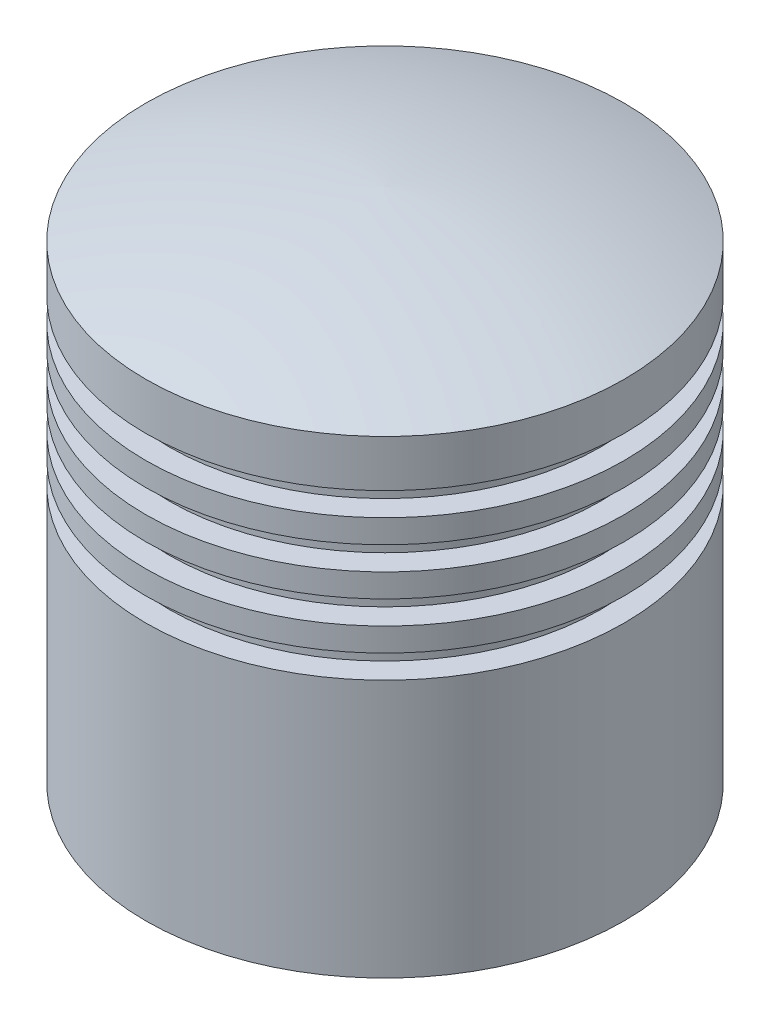
ISO-10303-21;
HEADER;
FILE_DESCRIPTION(('STEP AP214'),'2;1');
FILE_NAME('part.step','',(''),(''),'','','');
FILE_SCHEMA(('AUTOMOTIVE_DESIGN { 1 0 10303 214 1 1 1 1 }'));
ENDSEC;
DATA;
#1=APPLICATION_CONTEXT('core data for automotive mechanical design processes');
#2=APPLICATION_PROTOCOL_DEFINITION('international standard','automotive_design',2000,#1);
#3=PRODUCT_CONTEXT('',#1,'mechanical');
#4=PRODUCT('Part','Part','',(#3));
#5=PRODUCT_RELATED_PRODUCT_CATEGORY('part','',(#4));
#6=PRODUCT_DEFINITION_FORMATION('','',#4);
#7=PRODUCT_DEFINITION_CONTEXT('part definition',#1,'design');
#8=PRODUCT_DEFINITION('design','',#6,#7);
#9=PRODUCT_DEFINITION_SHAPE('','',#8);
#10=(LENGTH_UNIT() NAMED_UNIT(*) SI_UNIT(.MILLI.,.METRE.));
#11=(NAMED_UNIT(*) PLANE_ANGLE_UNIT() SI_UNIT($,.RADIAN.));
#12=(NAMED_UNIT(*) SI_UNIT($,.STERADIAN.) SOLID_ANGLE_UNIT());
#13=UNCERTAINTY_MEASURE_WITH_UNIT(LENGTH_MEASURE(1.E-05),#10,'distance_accuracy_value','');
#14=(GEOMETRIC_REPRESENTATION_CONTEXT(3) GLOBAL_UNCERTAINTY_ASSIGNED_CONTEXT((#13)) GLOBAL_UNIT_ASSIGNED_CONTEXT((#10,
#11,#12)) REPRESENTATION_CONTEXT('',''));
#15=CARTESIAN_POINT('',(0.,0.,0.));
#16=DIRECTION('',(0.,0.,1.));
#17=DIRECTION('',(1.,0.,0.));
#18=AXIS2_PLACEMENT_3D('',#15,#16,#17);
#19=CARTESIAN_POINT('',(46.,90.,0.));
#20=DIRECTION('',(0.,-1.,0.));
#21=DIRECTION('',(0.,0.,-1.));
#22=AXIS2_PLACEMENT_3D('',#19,#20,#21);
#23=PLANE('',#22);
#24=CARTESIAN_POINT('',(0.,90.,0.));
#25=DIRECTION('',(0.,-1.,0.));
#26=DIRECTION('',(0.,0.,-1.));
#27=AXIS2_PLACEMENT_3D('',#24,#25,#26);
#28=CIRCLE('',#27,51.);
#29=CARTESIAN_POINT('',(0.,90.,-51.));
#30=VERTEX_POINT('',#29);
#31=EDGE_CURVE('E11',#30,#30,#28,.T.);
#32=ORIENTED_EDGE('',*,*,#31,.T.);
#33=EDGE_LOOP('',(#32));
#34=FACE_BOUND('',#33,.T.);
#35=CARTESIAN_POINT('',(0.,90.,0.));
#36=DIRECTION('',(0.,-1.,0.));
#37=DIRECTION('',(0.,0.,-1.));
#38=AXIS2_PLACEMENT_3D('',#35,#36,#37);
#39=CIRCLE('',#38,46.);
#40=CARTESIAN_POINT('',(0.,90.,-46.));
#41=VERTEX_POINT('',#40);
#42=EDGE_CURVE('E144',#41,#41,#39,.T.);
#43=ORIENTED_EDGE('',*,*,#42,.F.);
#44=EDGE_LOOP('',(#43));
#45=FACE_BOUND('',#44,.T.);
#46=ADVANCED_FACE('F43',(#34,#45),#23,.T.);
#47=CARTESIAN_POINT('',(0.,0.,0.));
#48=DIRECTION('',(0.,-1.,0.));
#49=DIRECTION('',(0.,0.,-1.));
#50=AXIS2_PLACEMENT_3D('',#47,#48,#49);
#51=CYLINDRICAL_SURFACE('',#50,51.);
#52=CARTESIAN_POINT('',(0.,100.,0.));
#53=DIRECTION('',(0.,-1.,0.));
#54=DIRECTION('',(0.,0.,-1.));
#55=AXIS2_PLACEMENT_3D('',#52,#53,#54);
#56=CIRCLE('',#55,51.);
#57=CARTESIAN_POINT('',(0.,100.,-51.));
#58=VERTEX_POINT('',#57);
#59=EDGE_CURVE('E51',#58,#58,#56,.T.);
#60=ORIENTED_EDGE('',*,*,#59,.T.);
#61=EDGE_LOOP('',(#60));
#62=FACE_BOUND('',#61,.T.);
#63=ORIENTED_EDGE('',*,*,#31,.F.);
#64=EDGE_LOOP('',(#63));
#65=FACE_BOUND('',#64,.T.);
#66=ADVANCED_FACE('F61',(#62,#65),#51,.T.);
#67=CARTESIAN_POINT('',(0.,-59.8629003636879,6.82605889484076));
#68=DIRECTION('',(-1.,0.,0.));
#69=DIRECTION('',(0.,0.,-1.));
#70=AXIS2_PLACEMENT_3D('',#67,#68,#69);
#71=CIRCLE('',#70,170.);
#72=TRIMMED_CURVE('',#71,(PARAMETER_VALUE(-1.53063224157507)),
(PARAMETER_VALUE(1.53063224157507)),.T.,.PARAMETER.);
#73=CARTESIAN_POINT('',(0.,-59.8629003636879,0.));
#74=DIRECTION('',(0.,-1.,0.));
#75=AXIS1_PLACEMENT('',#73,#74);
#76=SURFACE_OF_REVOLUTION('',#72,#75);
#77=CARTESIAN_POINT('',(0.,110.,0.));
#78=VERTEX_POINT('',#77);
#79=VERTEX_LOOP('',#78);
#80=FACE_BOUND('',#79,.T.);
#81=ORIENTED_EDGE('',*,*,#59,.F.);
#82=EDGE_LOOP('',(#81));
#83=FACE_BOUND('',#82,.T.);
#84=ADVANCED_FACE('F57',(#80,#83),#76,.T.);
#85=CARTESIAN_POINT('',(0.,-59.8629003636879,6.82605889484076));
#86=DIRECTION('',(-1.,0.,0.));
#87=DIRECTION('',(0.,0.,-1.));
#88=AXIS2_PLACEMENT_3D('',#85,#86,#87);
#89=CIRCLE('',#88,163.);
#90=TRIMMED_CURVE('',#89,(PARAMETER_VALUE(-1.52890641478153)),
(PARAMETER_VALUE(1.52890641478153)),.T.,.PARAMETER.);
#91=CARTESIAN_POINT('',(0.,-59.8629003636879,0.));
#92=DIRECTION('',(0.,-1.,0.));
#93=AXIS1_PLACEMENT('',#91,#92);
#94=SURFACE_OF_REVOLUTION('',#90,#93);
#95=CARTESIAN_POINT('',(0.,97.4105197667831,0.));
#96=DIRECTION('',(0.,-1.,0.));
#97=DIRECTION('',(0.,0.,-1.));
#98=AXIS2_PLACEMENT_3D('',#95,#96,#97);
#99=CIRCLE('',#98,36.);
#100=CARTESIAN_POINT('',(0.,97.4105197667831,-36.));
#101=VERTEX_POINT('',#100);
#102=EDGE_CURVE('E67',#101,#101,#99,.T.);
#103=ORIENTED_EDGE('',*,*,#102,.T.);
#104=EDGE_LOOP('',(#103));
#105=FACE_BOUND('',#104,.T.);
#106=CARTESIAN_POINT('',(0.,102.994107222612,0.));
#107=VERTEX_POINT('',#106);
#108=VERTEX_LOOP('',#107);
#109=FACE_BOUND('',#108,.T.);
#110=ADVANCED_FACE('F60',(#105,#109),#94,.F.);
#111=CARTESIAN_POINT('',(0.,0.,0.));
#112=DIRECTION('',(0.,-1.,0.));
#113=DIRECTION('',(0.,0.,-1.));
#114=AXIS2_PLACEMENT_3D('',#111,#112,#113);
#115=CYLINDRICAL_SURFACE('',#114,36.);
#116=CARTESIAN_POINT('',(0.,30.,0.));
#117=DIRECTION('',(0.,-1.,0.));
#118=DIRECTION('',(0.,0.,-1.));
#119=AXIS2_PLACEMENT_3D('',#116,#117,#118);
#120=CIRCLE('',#119,36.);
#121=CARTESIAN_POINT('',(0.,30.,-36.));
#122=VERTEX_POINT('',#121);
#123=EDGE_CURVE('E70',#122,#122,#120,.T.);
#124=ORIENTED_EDGE('',*,*,#123,.T.);
#125=EDGE_LOOP('',(#124));
#126=FACE_BOUND('',#125,.T.);
#127=ORIENTED_EDGE('',*,*,#102,.F.);
#128=EDGE_LOOP('',(#127));
#129=FACE_BOUND('',#128,.T.);
#130=ADVANCED_FACE('F164',(#126,#129),#115,.F.);
#131=CARTESIAN_POINT('',(43.,30.,0.));
#132=DIRECTION('',(0.,-1.,0.));
#133=DIRECTION('',(0.,0.,-1.));
#134=AXIS2_PLACEMENT_3D('',#131,#132,#133);
#135=PLANE('',#134);
#136=CARTESIAN_POINT('',(0.,30.,0.));
#137=DIRECTION('',(0.,-1.,0.));
#138=DIRECTION('',(0.,0.,-1.));
#139=AXIS2_PLACEMENT_3D('',#136,#137,#138);
#140=CIRCLE('',#139,43.);
#141=CARTESIAN_POINT('',(0.,30.,-43.));
#142=VERTEX_POINT('',#141);
#143=EDGE_CURVE('E76',#142,#142,#140,.T.);
#144=ORIENTED_EDGE('',*,*,#143,.T.);
#145=EDGE_LOOP('',(#144));
#146=FACE_BOUND('',#145,.T.);
#147=ORIENTED_EDGE('',*,*,#123,.F.);
#148=EDGE_LOOP('',(#147));
#149=FACE_BOUND('',#148,.T.);
#150=ADVANCED_FACE('F168',(#146,#149),#135,.T.);
#151=CARTESIAN_POINT('',(0.,0.,0.));
#152=DIRECTION('',(0.,-1.,0.));
#153=DIRECTION('',(0.,0.,-1.));
#154=AXIS2_PLACEMENT_3D('',#151,#152,#153);
#155=CYLINDRICAL_SURFACE('',#154,43.);
#156=CARTESIAN_POINT('',(0.,0.,0.));
#157=DIRECTION('',(0.,-1.,0.));
#158=DIRECTION('',(0.,0.,-1.));
#159=AXIS2_PLACEMENT_3D('',#156,#157,#158);
#160=CIRCLE('',#159,43.);
#161=CARTESIAN_POINT('',(0.,0.,-43.));
#162=VERTEX_POINT('',#161);
#163=EDGE_CURVE('E80',#162,#162,#160,.T.);
#164=ORIENTED_EDGE('',*,*,#163,.T.);
#165=EDGE_LOOP('',(#164));
#166=FACE_BOUND('',#165,.T.);
#167=ORIENTED_EDGE('',*,*,#143,.F.);
#168=EDGE_LOOP('',(#167));
#169=FACE_BOUND('',#168,.T.);
#170=ADVANCED_FACE('F172',(#166,#169),#155,.F.);
#171=CARTESIAN_POINT('',(43.,0.,0.));
#172=DIRECTION('',(0.,-1.,0.));
#173=DIRECTION('',(0.,0.,-1.));
#174=AXIS2_PLACEMENT_3D('',#171,#172,#173);
#175=PLANE('',#174);
#176=CARTESIAN_POINT('',(0.,0.,0.));
#177=DIRECTION('',(0.,-1.,0.));
#178=DIRECTION('',(0.,0.,-1.));
#179=AXIS2_PLACEMENT_3D('',#176,#177,#178);
#180=CIRCLE('',#179,51.);
#181=CARTESIAN_POINT('',(0.,0.,-51.));
#182=VERTEX_POINT('',#181);
#183=EDGE_CURVE('E84',#182,#182,#180,.T.);
#184=ORIENTED_EDGE('',*,*,#183,.T.);
#185=EDGE_LOOP('',(#184));
#186=FACE_BOUND('',#185,.T.);
#187=ORIENTED_EDGE('',*,*,#163,.F.);
#188=EDGE_LOOP('',(#187));
#189=FACE_BOUND('',#188,.T.);
#190=ADVANCED_FACE('F176',(#186,#189),#175,.T.);
#191=CARTESIAN_POINT('',(0.,0.,0.));
#192=DIRECTION('',(0.,-1.,0.));
#193=DIRECTION('',(0.,0.,-1.));
#194=AXIS2_PLACEMENT_3D('',#191,#192,#193);
#195=CYLINDRICAL_SURFACE('',#194,51.);
#196=CARTESIAN_POINT('',(0.,55.,0.));
#197=DIRECTION('',(0.,-1.,0.));
#198=DIRECTION('',(0.,0.,-1.));
#199=AXIS2_PLACEMENT_3D('',#196,#197,#198);
#200=CIRCLE('',#199,51.);
#201=CARTESIAN_POINT('',(0.,55.,-51.));
#202=VERTEX_POINT('',#201);
#203=EDGE_CURVE('E88',#202,#202,#200,.T.);
#204=ORIENTED_EDGE('',*,*,#203,.T.);
#205=EDGE_LOOP('',(#204));
#206=FACE_BOUND('',#205,.T.);
#207=ORIENTED_EDGE('',*,*,#183,.F.);
#208=EDGE_LOOP('',(#207));
#209=FACE_BOUND('',#208,.T.);
#210=ADVANCED_FACE('F180',(#206,#209),#195,.T.);
#211=CARTESIAN_POINT('',(51.,55.,0.));
#212=DIRECTION('',(0.,1.,0.));
#213=DIRECTION('',(0.,0.,1.));
#214=AXIS2_PLACEMENT_3D('',#211,#212,#213);
#215=PLANE('',#214);
#216=CARTESIAN_POINT('',(0.,55.,0.));
#217=DIRECTION('',(0.,-1.,0.));
#218=DIRECTION('',(0.,0.,-1.));
#219=AXIS2_PLACEMENT_3D('',#216,#217,#218);
#220=CIRCLE('',#219,46.);
#221=CARTESIAN_POINT('',(0.,55.,-46.));
#222=VERTEX_POINT('',#221);
#223=EDGE_CURVE('E92',#222,#222,#220,.T.);
#224=ORIENTED_EDGE('',*,*,#223,.T.);
#225=EDGE_LOOP('',(#224));
#226=FACE_BOUND('',#225,.T.);
#227=ORIENTED_EDGE('',*,*,#203,.F.);
#228=EDGE_LOOP('',(#227));
#229=FACE_BOUND('',#228,.T.);
#230=ADVANCED_FACE('F184',(#226,#229),#215,.T.);
#231=CARTESIAN_POINT('',(0.,0.,0.));
#232=DIRECTION('',(0.,-1.,0.));
#233=DIRECTION('',(0.,0.,-1.));
#234=AXIS2_PLACEMENT_3D('',#231,#232,#233);
#235=CYLINDRICAL_SURFACE('',#234,46.);
#236=CARTESIAN_POINT('',(0.,60.,0.));
#237=DIRECTION('',(0.,-1.,0.));
#238=DIRECTION('',(0.,0.,-1.));
#239=AXIS2_PLACEMENT_3D('',#236,#237,#238);
#240=CIRCLE('',#239,46.);
#241=CARTESIAN_POINT('',(0.,60.,-46.));
#242=VERTEX_POINT('',#241);
#243=EDGE_CURVE('E96',#242,#242,#240,.T.);
#244=ORIENTED_EDGE('',*,*,#243,.T.);
#245=EDGE_LOOP('',(#244));
#246=FACE_BOUND('',#245,.T.);
#247=ORIENTED_EDGE('',*,*,#223,.F.);
#248=EDGE_LOOP('',(#247));
#249=FACE_BOUND('',#248,.T.);
#250=ADVANCED_FACE('F188',(#246,#249),#235,.T.);
#251=CARTESIAN_POINT('',(46.,60.,0.));
#252=DIRECTION('',(0.,-1.,0.));
#253=DIRECTION('',(0.,0.,-1.));
#254=AXIS2_PLACEMENT_3D('',#251,#252,#253);
#255=PLANE('',#254);
#256=CARTESIAN_POINT('',(0.,60.,0.));
#257=DIRECTION('',(0.,-1.,0.));
#258=DIRECTION('',(0.,0.,-1.));
#259=AXIS2_PLACEMENT_3D('',#256,#257,#258);
#260=CIRCLE('',#259,51.);
#261=CARTESIAN_POINT('',(0.,60.,-51.));
#262=VERTEX_POINT('',#261);
#263=EDGE_CURVE('E100',#262,#262,#260,.T.);
#264=ORIENTED_EDGE('',*,*,#263,.T.);
#265=EDGE_LOOP('',(#264));
#266=FACE_BOUND('',#265,.T.);
#267=ORIENTED_EDGE('',*,*,#243,.F.);
#268=EDGE_LOOP('',(#267));
#269=FACE_BOUND('',#268,.T.);
#270=ADVANCED_FACE('F192',(#266,#269),#255,.T.);
#271=CARTESIAN_POINT('',(0.,0.,0.));
#272=DIRECTION('',(0.,-1.,0.));
#273=DIRECTION('',(0.,0.,-1.));
#274=AXIS2_PLACEMENT_3D('',#271,#272,#273);
#275=CYLINDRICAL_SURFACE('',#274,51.);
#276=CARTESIAN_POINT('',(0.,65.,0.));
#277=DIRECTION('',(0.,-1.,0.));
#278=DIRECTION('',(0.,0.,-1.));
#279=AXIS2_PLACEMENT_3D('',#276,#277,#278);
#280=CIRCLE('',#279,51.);
#281=CARTESIAN_POINT('',(0.,65.,-51.));
#282=VERTEX_POINT('',#281);
#283=EDGE_CURVE('E104',#282,#282,#280,.T.);
#284=ORIENTED_EDGE('',*,*,#283,.T.);
#285=EDGE_LOOP('',(#284));
#286=FACE_BOUND('',#285,.T.);
#287=ORIENTED_EDGE('',*,*,#263,.F.);
#288=EDGE_LOOP('',(#287));
#289=FACE_BOUND('',#288,.T.);
#290=ADVANCED_FACE('F196',(#286,#289),#275,.T.);
#291=CARTESIAN_POINT('',(51.,65.,0.));
#292=DIRECTION('',(0.,1.,0.));
#293=DIRECTION('',(0.,0.,1.));
#294=AXIS2_PLACEMENT_3D('',#291,#292,#293);
#295=PLANE('',#294);
#296=CARTESIAN_POINT('',(0.,65.,0.));
#297=DIRECTION('',(0.,-1.,0.));
#298=DIRECTION('',(0.,0.,-1.));
#299=AXIS2_PLACEMENT_3D('',#296,#297,#298);
#300=CIRCLE('',#299,46.);
#301=CARTESIAN_POINT('',(0.,65.,-46.));
#302=VERTEX_POINT('',#301);
#303=EDGE_CURVE('E108',#302,#302,#300,.T.);
#304=ORIENTED_EDGE('',*,*,#303,.T.);
#305=EDGE_LOOP('',(#304));
#306=FACE_BOUND('',#305,.T.);
#307=ORIENTED_EDGE('',*,*,#283,.F.);
#308=EDGE_LOOP('',(#307));
#309=FACE_BOUND('',#308,.T.);
#310=ADVANCED_FACE('F200',(#306,#309),#295,.T.);
#311=CARTESIAN_POINT('',(0.,0.,0.));
#312=DIRECTION('',(0.,-1.,0.));
#313=DIRECTION('',(0.,0.,-1.));
#314=AXIS2_PLACEMENT_3D('',#311,#312,#313);
#315=CYLINDRICAL_SURFACE('',#314,46.);
#316=CARTESIAN_POINT('',(0.,70.,0.));
#317=DIRECTION('',(0.,-1.,0.));
#318=DIRECTION('',(0.,0.,-1.));
#319=AXIS2_PLACEMENT_3D('',#316,#317,#318);
#320=CIRCLE('',#319,46.);
#321=CARTESIAN_POINT('',(0.,70.,-46.));
#322=VERTEX_POINT('',#321);
#323=EDGE_CURVE('E112',#322,#322,#320,.T.);
#324=ORIENTED_EDGE('',*,*,#323,.T.);
#325=EDGE_LOOP('',(#324));
#326=FACE_BOUND('',#325,.T.);
#327=ORIENTED_EDGE('',*,*,#303,.F.);
#328=EDGE_LOOP('',(#327));
#329=FACE_BOUND('',#328,.T.);
#330=ADVANCED_FACE('F204',(#326,#329),#315,.T.);
#331=CARTESIAN_POINT('',(46.,70.,0.));
#332=DIRECTION('',(0.,-1.,0.));
#333=DIRECTION('',(0.,0.,-1.));
#334=AXIS2_PLACEMENT_3D('',#331,#332,#333);
#335=PLANE('',#334);
#336=CARTESIAN_POINT('',(0.,70.,0.));
#337=DIRECTION('',(0.,-1.,0.));
#338=DIRECTION('',(0.,0.,-1.));
#339=AXIS2_PLACEMENT_3D('',#336,#337,#338);
#340=CIRCLE('',#339,51.);
#341=CARTESIAN_POINT('',(0.,70.,-51.));
#342=VERTEX_POINT('',#341);
#343=EDGE_CURVE('E116',#342,#342,#340,.T.);
#344=ORIENTED_EDGE('',*,*,#343,.T.);
#345=EDGE_LOOP('',(#344));
#346=FACE_BOUND('',#345,.T.);
#347=ORIENTED_EDGE('',*,*,#323,.F.);
#348=EDGE_LOOP('',(#347));
#349=FACE_BOUND('',#348,.T.);
#350=ADVANCED_FACE('F208',(#346,#349),#335,.T.);
#351=CARTESIAN_POINT('',(0.,0.,0.));
#352=DIRECTION('',(0.,-1.,0.));
#353=DIRECTION('',(0.,0.,-1.));
#354=AXIS2_PLACEMENT_3D('',#351,#352,#353);
#355=CYLINDRICAL_SURFACE('',#354,51.);
#356=CARTESIAN_POINT('',(0.,75.,0.));
#357=DIRECTION('',(0.,-1.,0.));
#358=DIRECTION('',(0.,0.,-1.));
#359=AXIS2_PLACEMENT_3D('',#356,#357,#358);
#360=CIRCLE('',#359,51.);
#361=CARTESIAN_POINT('',(0.,75.,-51.));
#362=VERTEX_POINT('',#361);
#363=EDGE_CURVE('E120',#362,#362,#360,.T.);
#364=ORIENTED_EDGE('',*,*,#363,.T.);
#365=EDGE_LOOP('',(#364));
#366=FACE_BOUND('',#365,.T.);
#367=ORIENTED_EDGE('',*,*,#343,.F.);
#368=EDGE_LOOP('',(#367));
#369=FACE_BOUND('',#368,.T.);
#370=ADVANCED_FACE('F212',(#366,#369),#355,.T.);
#371=CARTESIAN_POINT('',(51.,75.,0.));
#372=DIRECTION('',(0.,1.,0.));
#373=DIRECTION('',(0.,0.,1.));
#374=AXIS2_PLACEMENT_3D('',#371,#372,#373);
#375=PLANE('',#374);
#376=CARTESIAN_POINT('',(0.,75.,0.));
#377=DIRECTION('',(0.,-1.,0.));
#378=DIRECTION('',(0.,0.,-1.));
#379=AXIS2_PLACEMENT_3D('',#376,#377,#378);
#380=CIRCLE('',#379,46.);
#381=CARTESIAN_POINT('',(0.,75.,-46.));
#382=VERTEX_POINT('',#381);
#383=EDGE_CURVE('E124',#382,#382,#380,.T.);
#384=ORIENTED_EDGE('',*,*,#383,.T.);
#385=EDGE_LOOP('',(#384));
#386=FACE_BOUND('',#385,.T.);
#387=ORIENTED_EDGE('',*,*,#363,.F.);
#388=EDGE_LOOP('',(#387));
#389=FACE_BOUND('',#388,.T.);
#390=ADVANCED_FACE('F216',(#386,#389),#375,.T.);
#391=CARTESIAN_POINT('',(0.,0.,0.));
#392=DIRECTION('',(0.,-1.,0.));
#393=DIRECTION('',(0.,0.,-1.));
#394=AXIS2_PLACEMENT_3D('',#391,#392,#393);
#395=CYLINDRICAL_SURFACE('',#394,46.);
#396=CARTESIAN_POINT('',(0.,80.,0.));
#397=DIRECTION('',(0.,-1.,0.));
#398=DIRECTION('',(0.,0.,-1.));
#399=AXIS2_PLACEMENT_3D('',#396,#397,#398);
#400=CIRCLE('',#399,46.);
#401=CARTESIAN_POINT('',(0.,80.,-46.));
#402=VERTEX_POINT('',#401);
#403=EDGE_CURVE('E128',#402,#402,#400,.T.);
#404=ORIENTED_EDGE('',*,*,#403,.T.);
#405=EDGE_LOOP('',(#404));
#406=FACE_BOUND('',#405,.T.);
#407=ORIENTED_EDGE('',*,*,#383,.F.);
#408=EDGE_LOOP('',(#407));
#409=FACE_BOUND('',#408,.T.);
#410=ADVANCED_FACE('F220',(#406,#409),#395,.T.);
#411=CARTESIAN_POINT('',(46.,80.,0.));
#412=DIRECTION('',(0.,-1.,0.));
#413=DIRECTION('',(0.,0.,-1.));
#414=AXIS2_PLACEMENT_3D('',#411,#412,#413);
#415=PLANE('',#414);
#416=CARTESIAN_POINT('',(0.,80.,0.));
#417=DIRECTION('',(0.,-1.,0.));
#418=DIRECTION('',(0.,0.,-1.));
#419=AXIS2_PLACEMENT_3D('',#416,#417,#418);
#420=CIRCLE('',#419,51.);
#421=CARTESIAN_POINT('',(0.,80.,-51.));
#422=VERTEX_POINT('',#421);
#423=EDGE_CURVE('E132',#422,#422,#420,.T.);
#424=ORIENTED_EDGE('',*,*,#423,.T.);
#425=EDGE_LOOP('',(#424));
#426=FACE_BOUND('',#425,.T.);
#427=ORIENTED_EDGE('',*,*,#403,.F.);
#428=EDGE_LOOP('',(#427));
#429=FACE_BOUND('',#428,.T.);
#430=ADVANCED_FACE('F224',(#426,#429),#415,.T.);
#431=CARTESIAN_POINT('',(0.,0.,0.));
#432=DIRECTION('',(0.,-1.,0.));
#433=DIRECTION('',(0.,0.,-1.));
#434=AXIS2_PLACEMENT_3D('',#431,#432,#433);
#435=CYLINDRICAL_SURFACE('',#434,51.);
#436=CARTESIAN_POINT('',(0.,85.,0.));
#437=DIRECTION('',(0.,-1.,0.));
#438=DIRECTION('',(0.,0.,-1.));
#439=AXIS2_PLACEMENT_3D('',#436,#437,#438);
#440=CIRCLE('',#439,51.);
#441=CARTESIAN_POINT('',(0.,85.,-51.));
#442=VERTEX_POINT('',#441);
#443=EDGE_CURVE('E136',#442,#442,#440,.T.);
#444=ORIENTED_EDGE('',*,*,#443,.T.);
#445=EDGE_LOOP('',(#444));
#446=FACE_BOUND('',#445,.T.);
#447=ORIENTED_EDGE('',*,*,#423,.F.);
#448=EDGE_LOOP('',(#447));
#449=FACE_BOUND('',#448,.T.);
#450=ADVANCED_FACE('F228',(#446,#449),#435,.T.);
#451=CARTESIAN_POINT('',(51.,85.,0.));
#452=DIRECTION('',(0.,1.,0.));
#453=DIRECTION('',(0.,0.,1.));
#454=AXIS2_PLACEMENT_3D('',#451,#452,#453);
#455=PLANE('',#454);
#456=CARTESIAN_POINT('',(0.,85.,0.));
#457=DIRECTION('',(0.,-1.,0.));
#458=DIRECTION('',(0.,0.,-1.));
#459=AXIS2_PLACEMENT_3D('',#456,#457,#458);
#460=CIRCLE('',#459,46.);
#461=CARTESIAN_POINT('',(0.,85.,-46.));
#462=VERTEX_POINT('',#461);
#463=EDGE_CURVE('E140',#462,#462,#460,.T.);
#464=ORIENTED_EDGE('',*,*,#463,.T.);
#465=EDGE_LOOP('',(#464));
#466=FACE_BOUND('',#465,.T.);
#467=ORIENTED_EDGE('',*,*,#443,.F.);
#468=EDGE_LOOP('',(#467));
#469=FACE_BOUND('',#468,.T.);
#470=ADVANCED_FACE('F232',(#466,#469),#455,.T.);
#471=CARTESIAN_POINT('',(0.,0.,0.));
#472=DIRECTION('',(0.,-1.,0.));
#473=DIRECTION('',(0.,0.,-1.));
#474=AXIS2_PLACEMENT_3D('',#471,#472,#473);
#475=CYLINDRICAL_SURFACE('',#474,46.);
#476=ORIENTED_EDGE('',*,*,#42,.T.);
#477=EDGE_LOOP('',(#476));
#478=FACE_BOUND('',#477,.T.);
#479=ORIENTED_EDGE('',*,*,#463,.F.);
#480=EDGE_LOOP('',(#479));
#481=FACE_BOUND('',#480,.T.);
#482=ADVANCED_FACE('F149',(#478,#481),#475,.T.);
#483=CLOSED_SHELL('',(#46,#66,#84,#110,#130,#150,#170,#190,#210,#230,#250,#270,#290,#310,#330,
#350,#370,#390,#410,#430,#450,#470,#482));
#484=MANIFOLD_SOLID_BREP('B2',#483);
#485=ADVANCED_BREP_SHAPE_REPRESENTATION('',(#18,#484),#14);
#486=SHAPE_DEFINITION_REPRESENTATION(#9,#485);
ENDSEC;
END-ISO-10303-21;
